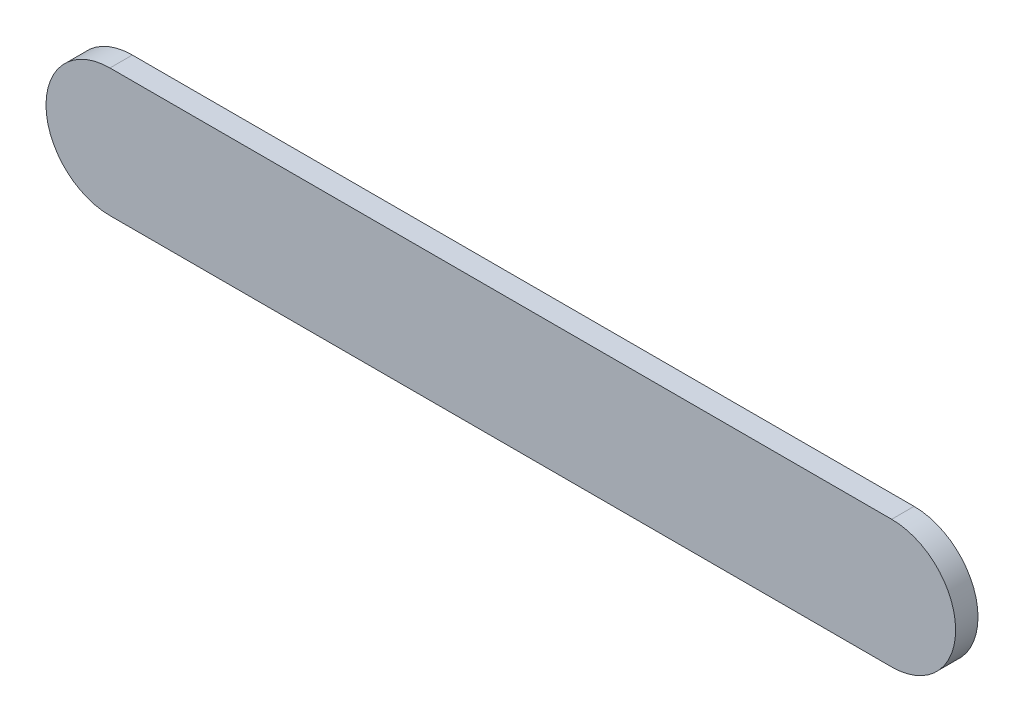
ISO-10303-21;
HEADER;
FILE_DESCRIPTION(('STEP AP214'),'2;1');
FILE_NAME('part.step','',(''),(''),'','','');
FILE_SCHEMA(('AUTOMOTIVE_DESIGN { 1 0 10303 214 1 1 1 1 }'));
ENDSEC;
DATA;
#1=APPLICATION_CONTEXT('core data for automotive mechanical design processes');
#2=APPLICATION_PROTOCOL_DEFINITION('international standard','automotive_design',2000,#1);
#3=PRODUCT_CONTEXT('',#1,'mechanical');
#4=PRODUCT('Part','Part','',(#3));
#5=PRODUCT_RELATED_PRODUCT_CATEGORY('part','',(#4));
#6=PRODUCT_DEFINITION_FORMATION('','',#4);
#7=PRODUCT_DEFINITION_CONTEXT('part definition',#1,'design');
#8=PRODUCT_DEFINITION('design','',#6,#7);
#9=PRODUCT_DEFINITION_SHAPE('','',#8);
#10=(LENGTH_UNIT() NAMED_UNIT(*) SI_UNIT(.MILLI.,.METRE.));
#11=(NAMED_UNIT(*) PLANE_ANGLE_UNIT() SI_UNIT($,.RADIAN.));
#12=(NAMED_UNIT(*) SI_UNIT($,.STERADIAN.) SOLID_ANGLE_UNIT());
#13=UNCERTAINTY_MEASURE_WITH_UNIT(LENGTH_MEASURE(1.E-05),#10,'distance_accuracy_value','');
#14=(GEOMETRIC_REPRESENTATION_CONTEXT(3) GLOBAL_UNCERTAINTY_ASSIGNED_CONTEXT((#13)) GLOBAL_UNIT_ASSIGNED_CONTEXT((#10,
#11,#12)) REPRESENTATION_CONTEXT('',''));
#15=CARTESIAN_POINT('',(0.,0.,0.));
#16=DIRECTION('',(0.,0.,1.));
#17=DIRECTION('',(1.,0.,0.));
#18=AXIS2_PLACEMENT_3D('',#15,#16,#17);
#19=CARTESIAN_POINT('',(87.26,-125.15,1.635));
#20=DIRECTION('',(0.,0.,1.));
#21=DIRECTION('',(1.,0.,0.));
#22=AXIS2_PLACEMENT_3D('',#19,#20,#21);
#23=PLANE('',#22);
#24=DIRECTION('',(1.,0.,0.));
#25=VECTOR('',#24,1.);
#26=CARTESIAN_POINT('',(87.26,-125.15,1.635));
#27=LINE('',#26,#25);
#28=CARTESIAN_POINT('',(87.26,-125.15,1.635));
#29=VERTEX_POINT('',#28);
#30=CARTESIAN_POINT('',(88.482233,-125.15,1.635));
#31=VERTEX_POINT('',#30);
#32=EDGE_CURVE('E92',#29,#31,#27,.T.);
#33=ORIENTED_EDGE('',*,*,#32,.T.);
#34=CARTESIAN_POINT('',(88.482233,-125.05,1.635));
#35=DIRECTION('',(0.,0.,1.));
#36=DIRECTION('',(0.,-1.,0.));
#37=AXIS2_PLACEMENT_3D('',#34,#35,#36);
#38=CIRCLE('',#37,0.1);
#39=CARTESIAN_POINT('',(88.482233,-124.95,1.635));
#40=VERTEX_POINT('',#39);
#41=EDGE_CURVE('E69',#31,#40,#38,.T.);
#42=ORIENTED_EDGE('',*,*,#41,.T.);
#43=DIRECTION('',(-1.,0.,0.));
#44=VECTOR('',#43,1.);
#45=CARTESIAN_POINT('',(88.482233,-124.95,1.635));
#46=LINE('',#45,#44);
#47=CARTESIAN_POINT('',(87.26,-124.95,1.635));
#48=VERTEX_POINT('',#47);
#49=EDGE_CURVE('E86',#40,#48,#46,.T.);
#50=ORIENTED_EDGE('',*,*,#49,.T.);
#51=CARTESIAN_POINT('',(87.26,-125.05,1.635));
#52=DIRECTION('',(0.,0.,1.));
#53=DIRECTION('',(0.,1.,0.));
#54=AXIS2_PLACEMENT_3D('',#51,#52,#53);
#55=CIRCLE('',#54,0.1);
#56=EDGE_CURVE('E11',#48,#29,#55,.T.);
#57=ORIENTED_EDGE('',*,*,#56,.T.);
#58=EDGE_LOOP('',(#33,#42,#50,#57));
#59=FACE_BOUND('',#58,.T.);
#60=ADVANCED_FACE('F17',(#59),#23,.T.);
#61=CARTESIAN_POINT('',(87.26,-125.15,1.6));
#62=DIRECTION('',(0.,0.,1.));
#63=DIRECTION('',(1.,0.,0.));
#64=AXIS2_PLACEMENT_3D('',#61,#62,#63);
#65=PLANE('',#64);
#66=CARTESIAN_POINT('',(87.26,-125.05,1.6));
#67=DIRECTION('',(0.,0.,1.));
#68=DIRECTION('',(0.,1.,0.));
#69=AXIS2_PLACEMENT_3D('',#66,#67,#68);
#70=CIRCLE('',#69,0.1);
#71=CARTESIAN_POINT('',(87.26,-124.95,1.6));
#72=VERTEX_POINT('',#71);
#73=CARTESIAN_POINT('',(87.26,-125.15,1.6));
#74=VERTEX_POINT('',#73);
#75=EDGE_CURVE('E20',#72,#74,#70,.T.);
#76=ORIENTED_EDGE('',*,*,#75,.F.);
#77=DIRECTION('',(-1.,0.,0.));
#78=VECTOR('',#77,1.);
#79=CARTESIAN_POINT('',(88.482233,-124.95,1.6));
#80=LINE('',#79,#78);
#81=CARTESIAN_POINT('',(88.482233,-124.95,1.6));
#82=VERTEX_POINT('',#81);
#83=EDGE_CURVE('E107',#82,#72,#80,.T.);
#84=ORIENTED_EDGE('',*,*,#83,.F.);
#85=CARTESIAN_POINT('',(88.482233,-125.05,1.6));
#86=DIRECTION('',(0.,0.,1.));
#87=DIRECTION('',(0.,-1.,0.));
#88=AXIS2_PLACEMENT_3D('',#85,#86,#87);
#89=CIRCLE('',#88,0.1);
#90=CARTESIAN_POINT('',(88.482233,-125.15,1.6));
#91=VERTEX_POINT('',#90);
#92=EDGE_CURVE('E75',#91,#82,#89,.T.);
#93=ORIENTED_EDGE('',*,*,#92,.F.);
#94=DIRECTION('',(1.,0.,0.));
#95=VECTOR('',#94,1.);
#96=CARTESIAN_POINT('',(87.26,-125.15,1.6));
#97=LINE('',#96,#95);
#98=EDGE_CURVE('E91',#74,#91,#97,.T.);
#99=ORIENTED_EDGE('',*,*,#98,.F.);
#100=EDGE_LOOP('',(#76,#84,#93,#99));
#101=FACE_BOUND('',#100,.T.);
#102=ADVANCED_FACE('F95',(#101),#65,.F.);
#103=CARTESIAN_POINT('',(87.26,-125.05,1.6));
#104=DIRECTION('',(0.,0.,-1.));
#105=DIRECTION('',(0.,1.,0.));
#106=AXIS2_PLACEMENT_3D('',#103,#104,#105);
#107=CYLINDRICAL_SURFACE('',#106,0.1);
#108=ORIENTED_EDGE('',*,*,#75,.T.);
#109=DIRECTION('',(0.,0.,1.));
#110=VECTOR('',#109,1.);
#111=CARTESIAN_POINT('',(87.26,-125.15,1.6));
#112=LINE('',#111,#110);
#113=EDGE_CURVE('E80',#74,#29,#112,.T.);
#114=ORIENTED_EDGE('',*,*,#113,.T.);
#115=ORIENTED_EDGE('',*,*,#56,.F.);
#116=DIRECTION('',(0.,0.,1.));
#117=VECTOR('',#116,1.);
#118=CARTESIAN_POINT('',(87.26,-124.95,1.6));
#119=LINE('',#118,#117);
#120=EDGE_CURVE('E83',#72,#48,#119,.T.);
#121=ORIENTED_EDGE('',*,*,#120,.F.);
#122=EDGE_LOOP('',(#108,#114,#115,#121));
#123=FACE_BOUND('',#122,.T.);
#124=ADVANCED_FACE('F79',(#123),#107,.T.);
#125=CARTESIAN_POINT('',(88.482233,-124.95,1.6));
#126=DIRECTION('',(0.,-1.,0.));
#127=DIRECTION('',(0.,0.,-1.));
#128=AXIS2_PLACEMENT_3D('',#125,#126,#127);
#129=PLANE('',#128);
#130=ORIENTED_EDGE('',*,*,#83,.T.);
#131=ORIENTED_EDGE('',*,*,#120,.T.);
#132=ORIENTED_EDGE('',*,*,#49,.F.);
#133=DIRECTION('',(0.,0.,1.));
#134=VECTOR('',#133,1.);
#135=CARTESIAN_POINT('',(88.482233,-124.95,1.6));
#136=LINE('',#135,#134);
#137=EDGE_CURVE('E110',#82,#40,#136,.T.);
#138=ORIENTED_EDGE('',*,*,#137,.F.);
#139=EDGE_LOOP('',(#130,#131,#132,#138));
#140=FACE_BOUND('',#139,.T.);
#141=ADVANCED_FACE('F123',(#140),#129,.F.);
#142=CARTESIAN_POINT('',(88.482233,-125.05,1.6));
#143=DIRECTION('',(0.,0.,-1.));
#144=DIRECTION('',(0.,-1.,0.));
#145=AXIS2_PLACEMENT_3D('',#142,#143,#144);
#146=CYLINDRICAL_SURFACE('',#145,0.1);
#147=ORIENTED_EDGE('',*,*,#92,.T.);
#148=ORIENTED_EDGE('',*,*,#137,.T.);
#149=ORIENTED_EDGE('',*,*,#41,.F.);
#150=DIRECTION('',(0.,0.,1.));
#151=VECTOR('',#150,1.);
#152=CARTESIAN_POINT('',(88.482233,-125.15,1.6));
#153=LINE('',#152,#151);
#154=EDGE_CURVE('E97',#91,#31,#153,.T.);
#155=ORIENTED_EDGE('',*,*,#154,.F.);
#156=EDGE_LOOP('',(#147,#148,#149,#155));
#157=FACE_BOUND('',#156,.T.);
#158=ADVANCED_FACE('F124',(#157),#146,.T.);
#159=CARTESIAN_POINT('',(87.26,-125.15,1.6));
#160=DIRECTION('',(0.,1.,0.));
#161=DIRECTION('',(1.,0.,0.));
#162=AXIS2_PLACEMENT_3D('',#159,#160,#161);
#163=PLANE('',#162);
#164=ORIENTED_EDGE('',*,*,#98,.T.);
#165=ORIENTED_EDGE('',*,*,#154,.T.);
#166=ORIENTED_EDGE('',*,*,#32,.F.);
#167=ORIENTED_EDGE('',*,*,#113,.F.);
#168=EDGE_LOOP('',(#164,#165,#166,#167));
#169=FACE_BOUND('',#168,.T.);
#170=ADVANCED_FACE('F89',(#169),#163,.F.);
#171=CLOSED_SHELL('',(#60,#102,#124,#141,#158,#170));
#172=MANIFOLD_SOLID_BREP('B1',#171);
#173=ADVANCED_BREP_SHAPE_REPRESENTATION('',(#18,#172),#14);
#174=SHAPE_DEFINITION_REPRESENTATION(#9,#173);
ENDSEC;
END-ISO-10303-21;
